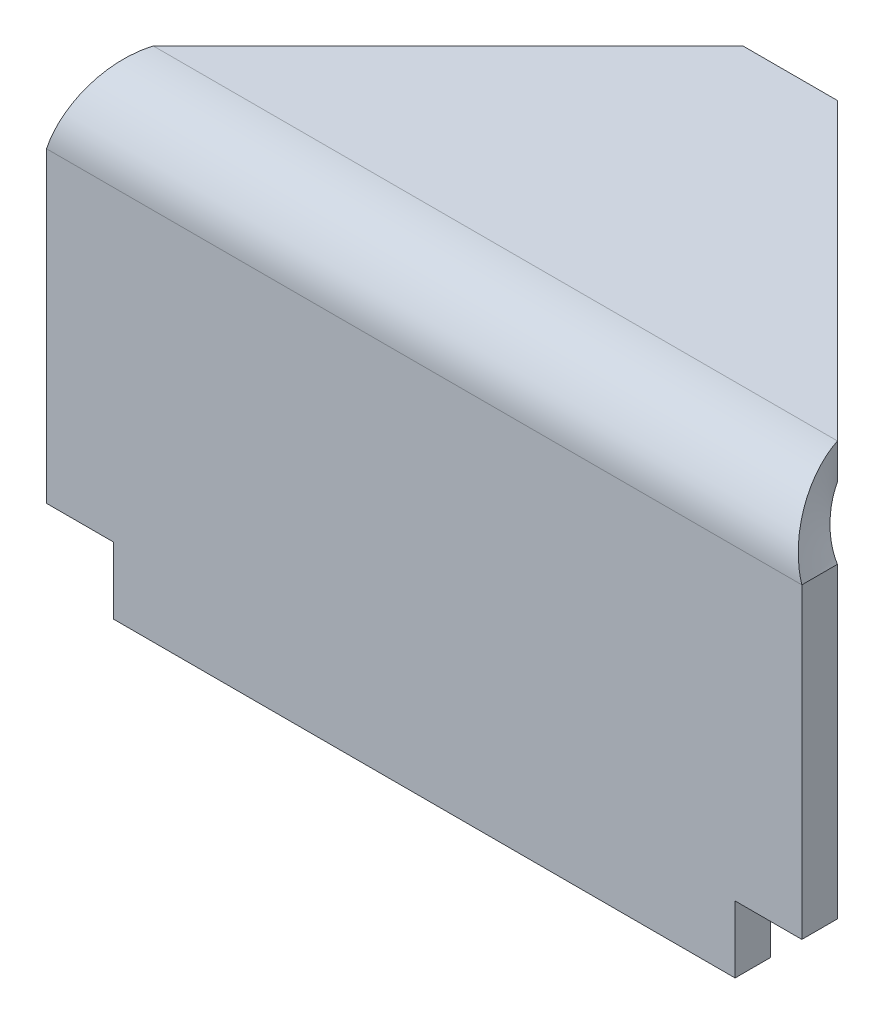
ISO-10303-21;
HEADER;
FILE_DESCRIPTION(('STEP AP214'),'2;1');
FILE_NAME('part.step','',(''),(''),'','','');
FILE_SCHEMA(('AUTOMOTIVE_DESIGN { 1 0 10303 214 1 1 1 1 }'));
ENDSEC;
DATA;
#1=APPLICATION_CONTEXT('core data for automotive mechanical design processes');
#2=APPLICATION_PROTOCOL_DEFINITION('international standard','automotive_design',2000,#1);
#3=PRODUCT_CONTEXT('',#1,'mechanical');
#4=PRODUCT('Part','Part','',(#3));
#5=PRODUCT_RELATED_PRODUCT_CATEGORY('part','',(#4));
#6=PRODUCT_DEFINITION_FORMATION('','',#4);
#7=PRODUCT_DEFINITION_CONTEXT('part definition',#1,'design');
#8=PRODUCT_DEFINITION('design','',#6,#7);
#9=PRODUCT_DEFINITION_SHAPE('','',#8);
#10=(LENGTH_UNIT() NAMED_UNIT(*) SI_UNIT(.MILLI.,.METRE.));
#11=(NAMED_UNIT(*) PLANE_ANGLE_UNIT() SI_UNIT($,.RADIAN.));
#12=(NAMED_UNIT(*) SI_UNIT($,.STERADIAN.) SOLID_ANGLE_UNIT());
#13=UNCERTAINTY_MEASURE_WITH_UNIT(LENGTH_MEASURE(1.E-05),#10,'distance_accuracy_value','');
#14=(GEOMETRIC_REPRESENTATION_CONTEXT(3) GLOBAL_UNCERTAINTY_ASSIGNED_CONTEXT((#13)) GLOBAL_UNIT_ASSIGNED_CONTEXT((#10,
#11,#12)) REPRESENTATION_CONTEXT('',''));
#15=CARTESIAN_POINT('',(0.,0.,0.));
#16=DIRECTION('',(0.,0.,1.));
#17=DIRECTION('',(1.,0.,0.));
#18=AXIS2_PLACEMENT_3D('',#15,#16,#17);
#19=CARTESIAN_POINT('',(0.,-8.,-84.8528137423857));
#20=DIRECTION('',(-0.707106781186548,0.,-0.707106781186547));
#21=DIRECTION('',(-0.707106781186547,0.,0.707106781186548));
#22=AXIS2_PLACEMENT_3D('',#19,#20,#21);
#23=PLANE('',#22);
#24=DIRECTION('',(-0.707106781186547,0.,0.707106781186548));
#25=VECTOR('',#24,1.);
#26=CARTESIAN_POINT('',(0.,0.,-84.8528137423857));
#27=LINE('',#26,#25);
#28=CARTESIAN_POINT('',(-10.6066017177983,0.,-74.2462120245875));
#29=VERTEX_POINT('',#28);
#30=CARTESIAN_POINT('',(-76.8528137423857,0.,-7.99999999999999));
#31=VERTEX_POINT('',#30);
#32=EDGE_CURVE('E178',#29,#31,#27,.T.);
#33=ORIENTED_EDGE('',*,*,#32,.F.);
#34=DIRECTION('',(0.,-1.,0.));
#35=VECTOR('',#34,1.);
#36=CARTESIAN_POINT('',(-10.6066017177983,-8.,-74.2462120245875));
#37=LINE('',#36,#35);
#38=CARTESIAN_POINT('',(-10.6066017177983,-8.,-74.2462120245875));
#39=VERTEX_POINT('',#38);
#40=EDGE_CURVE('E46',#29,#39,#37,.T.);
#41=ORIENTED_EDGE('',*,*,#40,.T.);
#42=DIRECTION('',(-0.707106781186547,0.,0.707106781186548));
#43=VECTOR('',#42,1.);
#44=CARTESIAN_POINT('',(0.,-8.,-84.8528137423857));
#45=LINE('',#44,#43);
#46=CARTESIAN_POINT('',(-76.8528137423857,-8.,-8.));
#47=VERTEX_POINT('',#46);
#48=EDGE_CURVE('E227',#39,#47,#45,.T.);
#49=ORIENTED_EDGE('',*,*,#48,.T.);
#50=DIRECTION('',(0.,1.,0.));
#51=VECTOR('',#50,1.);
#52=CARTESIAN_POINT('',(-76.8528137423857,-7.99999999999997,-8.));
#53=LINE('',#52,#51);
#54=EDGE_CURVE('E179',#47,#31,#53,.T.);
#55=ORIENTED_EDGE('',*,*,#54,.T.);
#56=EDGE_LOOP('',(#33,#41,#49,#55));
#57=FACE_BOUND('',#56,.T.);
#58=ADVANCED_FACE('F38',(#57),#23,.T.);
#59=CARTESIAN_POINT('',(84.8528137423857,-8.,0.));
#60=DIRECTION('',(0.707106781186547,0.,-0.707106781186548));
#61=DIRECTION('',(-0.707106781186548,0.,-0.707106781186547));
#62=AXIS2_PLACEMENT_3D('',#59,#60,#61);
#63=PLANE('',#62);
#64=DIRECTION('',(-0.707106781186548,0.,-0.707106781186547));
#65=VECTOR('',#64,1.);
#66=CARTESIAN_POINT('',(84.8528137423857,-8.,0.));
#67=LINE('',#66,#65);
#68=CARTESIAN_POINT('',(76.8528137423857,-8.,-8.00000000000003));
#69=VERTEX_POINT('',#68);
#70=CARTESIAN_POINT('',(10.6066017177982,-8.,-74.2462120245875));
#71=VERTEX_POINT('',#70);
#72=EDGE_CURVE('E266',#69,#71,#67,.T.);
#73=ORIENTED_EDGE('',*,*,#72,.T.);
#74=DIRECTION('',(0.,1.,0.));
#75=VECTOR('',#74,1.);
#76=CARTESIAN_POINT('',(10.6066017177982,-8.,-74.2462120245875));
#77=LINE('',#76,#75);
#78=CARTESIAN_POINT('',(10.6066017177982,0.,-74.2462120245875));
#79=VERTEX_POINT('',#78);
#80=EDGE_CURVE('E262',#71,#79,#77,.T.);
#81=ORIENTED_EDGE('',*,*,#80,.T.);
#82=DIRECTION('',(-0.707106781186548,0.,-0.707106781186547));
#83=VECTOR('',#82,1.);
#84=CARTESIAN_POINT('',(84.8528137423857,0.,0.));
#85=LINE('',#84,#83);
#86=CARTESIAN_POINT('',(76.8528137423857,0.,-8.00000000000003));
#87=VERTEX_POINT('',#86);
#88=EDGE_CURVE('E256',#87,#79,#85,.T.);
#89=ORIENTED_EDGE('',*,*,#88,.F.);
#90=DIRECTION('',(0.,1.,0.));
#91=VECTOR('',#90,1.);
#92=CARTESIAN_POINT('',(76.8528137423857,-7.99999999999997,-8.00000000000002));
#93=LINE('',#92,#91);
#94=EDGE_CURVE('E175',#69,#87,#93,.T.);
#95=ORIENTED_EDGE('',*,*,#94,.F.);
#96=EDGE_LOOP('',(#73,#81,#89,#95));
#97=FACE_BOUND('',#96,.T.);
#98=ADVANCED_FACE('F245',(#97),#63,.T.);
#99=CARTESIAN_POINT('',(0.,-8.,0.));
#100=DIRECTION('',(0.,-1.,0.));
#101=DIRECTION('',(0.,0.,-1.));
#102=AXIS2_PLACEMENT_3D('',#99,#100,#101);
#103=PLANE('',#102);
#104=ORIENTED_EDGE('',*,*,#48,.F.);
#105=DIRECTION('',(-1.,0.,0.));
#106=VECTOR('',#105,1.);
#107=CARTESIAN_POINT('',(0.,-8.,-74.2462120245875));
#108=LINE('',#107,#106);
#109=EDGE_CURVE('E11',#39,#71,#108,.F.);
#110=ORIENTED_EDGE('',*,*,#109,.T.);
#111=ORIENTED_EDGE('',*,*,#72,.F.);
#112=DIRECTION('',(-1.,0.,0.));
#113=VECTOR('',#112,1.);
#114=CARTESIAN_POINT('',(-84.8528137423857,-7.99999999999997,-8.));
#115=LINE('',#114,#113);
#116=EDGE_CURVE('E167',#47,#69,#115,.F.);
#117=ORIENTED_EDGE('',*,*,#116,.F.);
#118=EDGE_LOOP('',(#104,#110,#111,#117));
#119=FACE_BOUND('',#118,.T.);
#120=ADVANCED_FACE('F235',(#119),#103,.T.);
#121=CARTESIAN_POINT('',(0.,0.,0.));
#122=DIRECTION('',(0.,-1.,0.));
#123=DIRECTION('',(0.,0.,-1.));
#124=AXIS2_PLACEMENT_3D('',#121,#122,#123);
#125=PLANE('',#124);
#126=ORIENTED_EDGE('',*,*,#88,.T.);
#127=DIRECTION('',(1.,0.,0.));
#128=VECTOR('',#127,1.);
#129=CARTESIAN_POINT('',(10.6066017177982,0.,-74.2462120245875));
#130=LINE('',#129,#128);
#131=EDGE_CURVE('E60',#79,#29,#130,.F.);
#132=ORIENTED_EDGE('',*,*,#131,.T.);
#133=ORIENTED_EDGE('',*,*,#32,.T.);
#134=DIRECTION('',(-1.,0.,0.));
#135=VECTOR('',#134,1.);
#136=CARTESIAN_POINT('',(-84.8528137423857,0.,-7.99999999999999));
#137=LINE('',#136,#135);
#138=EDGE_CURVE('E171',#31,#87,#137,.F.);
#139=ORIENTED_EDGE('',*,*,#138,.T.);
#140=EDGE_LOOP('',(#126,#132,#133,#139));
#141=FACE_BOUND('',#140,.T.);
#142=ADVANCED_FACE('F244',(#141),#125,.F.);
#143=CARTESIAN_POINT('',(76.8528137423857,0.080000000000026,-8.00000000000004));
#144=CARTESIAN_POINT('',(77.5195897851141,0.0800000000000273,-5.89478796351405));
#145=CARTESIAN_POINT('',(78.186147075719,-0.338519359173458,-3.79109401950281));
#146=CARTESIAN_POINT('',(79.5194804090524,-1.94951487526351,0.0981932043640329));
#147=CARTESIAN_POINT('',(80.186147075719,-3.14135717423723,1.8819112571966));
#148=CARTESIAN_POINT('',(81.5194804090524,-6.11808874280334,4.85864282576271));
#149=CARTESIAN_POINT('',(82.1861470757191,-7.90180679563591,6.05048512473644));
#150=CARTESIAN_POINT('',(83.5194804090524,-11.7910940195027,7.66148064082649));
#151=CARTESIAN_POINT('',(84.1860376996573,-13.894787963514,8.07999999999997));
#152=CARTESIAN_POINT('',(84.8528137423857,-16.,8.07999999999997));
#153=CARTESIAN_POINT('',(76.8528137423857,0.,-8.00000000000004));
#154=CARTESIAN_POINT('',(77.5195895490439,0.,-5.90526202421113));
#155=CARTESIAN_POINT('',(78.186147075719,-0.416437173306923,-3.81203385025155));
#156=CARTESIAN_POINT('',(79.5194804090524,-2.01941778633185,0.057903685934361));
#157=CARTESIAN_POINT('',(80.186147075719,-3.20533052162909,1.83274751959861));
#158=CARTESIAN_POINT('',(81.5194804090524,-6.16725248040133,4.79466947837086));
#159=CARTESIAN_POINT('',(82.1861470757191,-7.94209631406558,5.9805822136681));
#160=CARTESIAN_POINT('',(83.5194804090524,-11.8120338502515,7.58356282669302));
#161=CARTESIAN_POINT('',(84.1860379357275,-13.9052620242111,7.99999999999997));
#162=CARTESIAN_POINT('',(84.8528137423857,-16.,7.99999999999997));
#163=CARTESIAN_POINT('',(76.8528137423857,-7.99999999999997,-8.00000000000003));
#164=CARTESIAN_POINT('',(77.5195659420278,-7.99999999999997,-6.95266809391979));
#165=CARTESIAN_POINT('',(78.186147075719,-8.20821858665345,-5.90601692512579));
#166=CARTESIAN_POINT('',(79.5194804090524,-9.00970889316591,-3.97104815703283));
#167=CARTESIAN_POINT('',(80.186147075719,-9.60266526081453,-3.08362624020071));
#168=CARTESIAN_POINT('',(81.5194804090524,-11.0836262402007,-1.60266526081459));
#169=CARTESIAN_POINT('',(82.1861470757191,-11.9710481570328,-1.00970889316596));
#170=CARTESIAN_POINT('',(83.5194804090524,-13.9060169251257,-0.208218586653501));
#171=CARTESIAN_POINT('',(84.1860615427436,-14.9526680939197,0.));
#172=CARTESIAN_POINT('',(84.8528137423857,-16.,0.));
#173=CARTESIAN_POINT('',(76.8528137423857,-8.08079999999998,-8.00000000000003));
#174=CARTESIAN_POINT('',(77.519565703597,-8.08079999999998,-6.96324689522385));
#175=CARTESIAN_POINT('',(78.186147075719,-8.28691557892825,-5.92716615418202));
#176=CARTESIAN_POINT('',(79.5194804090524,-9.08031083334493,-4.0117405706468));
#177=CARTESIAN_POINT('',(80.186147075719,-9.6672783416803,-3.13328161517468));
#178=CARTESIAN_POINT('',(81.5194804090524,-11.1332816151746,-1.66727834168036));
#179=CARTESIAN_POINT('',(82.1861470757191,-12.0117405706467,-1.08031083334499));
#180=CARTESIAN_POINT('',(83.5194804090524,-13.927166154182,-0.286915578928301));
#181=CARTESIAN_POINT('',(84.1860617811744,-14.9632468952238,-0.0808000000000276));
#182=CARTESIAN_POINT('',(84.8528137423857,-16.,-0.0808000000000278));
#183=B_SPLINE_SURFACE_WITH_KNOTS('',1,3,((#143,#144,#145,#146,#147,#148,#149,#150,#151,#152),
(#153,#154,#155,#156,#157,#158,#159,#160,#161,#162),(#163,#164,#165,#166,#167,#168,#169,#170,
#171,#172),(#173,#174,#175,#176,#177,#178,#179,#180,#181,#182)),.UNSPECIFIED.,.F.,.F.,.F.,(2,1,
1,2),(4,2,2,2,4),(-0.01,0.,1.,1.0101),(0.,0.25,0.5,0.75,1.),.UNSPECIFIED.);
#184=DIRECTION('',(0.,0.,1.));
#185=VECTOR('',#184,1.);
#186=CARTESIAN_POINT('',(84.8528137423857,-16.,0.));
#187=LINE('',#186,#185);
#188=CARTESIAN_POINT('',(84.8528137423857,-15.9999999999999,0.));
#189=VERTEX_POINT('',#188);
#190=CARTESIAN_POINT('',(84.8528137423857,-15.9999999999999,7.99999999999997));
#191=VERTEX_POINT('',#190);
#192=EDGE_CURVE('E283',#189,#191,#187,.T.);
#193=CARTESIAN_POINT('',(76.8528137423857,-7.99999999999997,-8.00000000000003));
#194=CARTESIAN_POINT('',(76.9749189400977,-7.99998738498239,-7.80820315116032));
#195=CARTESIAN_POINT('',(77.0970243577444,-8.00689689739085,-7.61640815139459));
#196=CARTESIAN_POINT('',(77.3412292631348,-8.03446882717196,-7.2338127074068));
#197=CARTESIAN_POINT('',(77.4633287509491,-8.05513086442409,-7.04301223584283));
#198=CARTESIAN_POINT('',(77.707522144721,-8.11011649611955,-6.6633860446777));
#199=CARTESIAN_POINT('',(77.8296160506801,-8.14444008695765,-6.47456032455543));
#200=CARTESIAN_POINT('',(78.0736248447141,-8.22650560001264,-6.10014240831911));
#201=CARTESIAN_POINT('',(78.1955397307061,-8.27422761798111,-5.9145458461419));
#202=CARTESIAN_POINT('',(78.4393717022721,-8.38286335616471,-5.54726700202294));
#203=CARTESIAN_POINT('',(78.5612887873735,-8.4437763652548,-5.36558450965436));
#204=CARTESIAN_POINT('',(78.8051041750122,-8.57847035141285,-5.0070798345975));
#205=CARTESIAN_POINT('',(78.9270024782729,-8.65225032430575,-4.83025727387179));
#206=CARTESIAN_POINT('',(79.218936261308,-8.84391362495795,-4.41367646753827));
#207=CARTESIAN_POINT('',(79.3889844909762,-8.96771147885369,-4.17661908006798));
#208=CARTESIAN_POINT('',(79.7290727908021,-9.23840213503381,-3.71605717089866));
#209=CARTESIAN_POINT('',(79.8991128579397,-9.38529750901114,-3.49255416219737));
#210=CARTESIAN_POINT('',(80.2391001143304,-9.70060065685136,-3.06149570812018));
#211=CARTESIAN_POINT('',(80.4090472942256,-9.86899475159644,-2.85393025539158));
#212=CARTESIAN_POINT('',(80.7489421939448,-10.2256813820518,-2.45667015261631));
#213=CARTESIAN_POINT('',(80.9188899137652,-10.4139738533153,-2.26697544469372));
#214=CARTESIAN_POINT('',(81.2587720685316,-10.8085596734352,-1.90736531709746));
#215=CARTESIAN_POINT('',(81.4287065035438,-11.0148517105418,-1.73744845818148));
#216=CARTESIAN_POINT('',(81.7685686452424,-11.443396982379,-1.41907140620825));
#217=CARTESIAN_POINT('',(81.9384963515758,-11.6656506939236,-1.27061185453226));
#218=CARTESIAN_POINT('',(82.2784167006783,-12.1239454252777,-0.996607359126772));
#219=CARTESIAN_POINT('',(82.4484093468098,-12.3599908394198,-0.87106977196313));
#220=CARTESIAN_POINT('',(82.788383257162,-12.8434319366419,-0.64423009159432));
#221=CARTESIAN_POINT('',(82.9583645204965,-13.090826333482,-0.542925260011286));
#222=CARTESIAN_POINT('',(83.2721040786101,-13.5556516805042,-0.379227125741147));
#223=CARTESIAN_POINT('',(83.4158663688316,-13.7718243718864,-0.313243090472209));
#224=CARTESIAN_POINT('',(83.7033707934883,-14.2089645876502,-0.199796503644891));
#225=CARTESIAN_POINT('',(83.8471129283668,-14.4299315679775,-0.152331861996371));
#226=CARTESIAN_POINT('',(84.13450160139,-14.8749283514481,-0.0762947037190452));
#227=CARTESIAN_POINT('',(84.2781481365561,-15.0989559196096,-0.0477090822954684));
#228=CARTESIAN_POINT('',(84.5654669162563,-15.5486543535626,-0.00954830364290483));
#229=CARTESIAN_POINT('',(84.7091391614521,-15.7743254573621,2.4042942755739E-05));
#230=CARTESIAN_POINT('',(84.8528137423857,-16.,0.));
#231=B_SPLINE_CURVE_WITH_KNOTS('',3,(#193,#194,#195,#196,#197,#198,#199,#200,#201,#202,#203,
#204,#205,#206,#207,#208,#209,#210,#211,#212,#213,#214,#215,#216,#217,#218,#219,#220,#221,#222,
#223,#224,#225,#226,#227,#228,#229,#230),.UNSPECIFIED.,.F.,.F.,(4,2,2,2,2,2,2,2,2,2,2,2,2,2,2,2,
2,2,4),(0.,0.681993655959275,1.3639684623603,2.04594308879171,2.72690990929965,3.4078400280874,
4.08871702888055,5.03828930648889,5.987967385056,6.93704419006551,7.8861179213033,
8.83512254481493,9.78415552919938,10.7334925625186,11.6827222670239,12.4856593054104,
13.2885056984665,14.0907942115984,14.893201314458),.UNSPECIFIED.);
#232=EDGE_CURVE('E170',#69,#189,#231,.T.);
#233=CARTESIAN_POINT('',(76.8528137423857,0.,-8.00000000000004));
#234=CARTESIAN_POINT('',(76.9530502869086,1.15024033777008E-05,-7.68510328388166));
#235=CARTESIAN_POINT('',(77.0532884418186,-0.00929581702943927,-7.37020843234942));
#236=CARTESIAN_POINT('',(77.253758318419,-0.0464640994099785,-6.74153165556721));
#237=CARTESIAN_POINT('',(77.353990040171,-0.0743240884168942,-6.42774967276535));
#238=CARTESIAN_POINT('',(77.5544460857959,-0.14851304700506,-5.80238026617461));
#239=CARTESIAN_POINT('',(77.6546704097707,-0.194841678483456,-5.49079280231723));
#240=CARTESIAN_POINT('',(77.8550387064282,-0.305758847520925,-4.87113723363835));
#241=CARTESIAN_POINT('',(77.9551826806912,-0.370333085899775,-4.56306656861021));
#242=CARTESIAN_POINT('',(78.1554739657707,-0.517533839070055,-3.95126876337701));
#243=CARTESIAN_POINT('',(78.2556212765351,-0.600160144560493,-3.64754157285592));
#244=CARTESIAN_POINT('',(78.4559155007144,-0.783167395292755,-3.04550578582104));
#245=CARTESIAN_POINT('',(78.5560624141281,-0.883548233026464,-2.74719715650857));
#246=CARTESIAN_POINT('',(78.8065267934713,-1.15638193681905,-2.00918311532842));
#247=CARTESIAN_POINT('',(78.9568559967877,-1.33975473289744,-1.57347203555686));
#248=CARTESIAN_POINT('',(79.2575409632407,-1.74435829976984,-0.719906174484315));
#249=CARTESIAN_POINT('',(79.4078967272657,-1.96559405909139,-0.302053755178077));
#250=CARTESIAN_POINT('',(79.6333730530951,-2.32442906699824,0.308703801469487));
#251=CARTESIAN_POINT('',(79.7085244039113,-2.44854153071094,0.509624941849588));
#252=CARTESIAN_POINT('',(79.8588050156483,-2.70549708624667,0.905723387232024));
#253=CARTESIAN_POINT('',(79.9339342768243,-2.83833770703975,1.10090229545673));
#254=CARTESIAN_POINT('',(80.1593396341803,-3.24965192878628,1.67736514405021));
#255=CARTESIAN_POINT('',(80.3096465057581,-3.54093898829818,2.04961110792482));
#256=CARTESIAN_POINT('',(80.6102374211007,-4.1552301698679,2.76682005604089));
#257=CARTESIAN_POINT('',(80.7605214657102,-4.47823226672857,3.11178477981827));
#258=CARTESIAN_POINT('',(81.061092667058,-5.15346702769173,3.77181466486682));
#259=CARTESIAN_POINT('',(81.2113798238115,-5.50569992354069,4.08687958904512));
#260=CARTESIAN_POINT('',(81.512018407182,-6.2368339452153,4.68477893279997));
#261=CARTESIAN_POINT('',(81.6623698364956,-6.61574516710953,4.9676010432961));
#262=CARTESIAN_POINT('',(81.8878450769687,-7.20162335610023,5.3657914188243));
#263=CARTESIAN_POINT('',(81.9629974287016,-7.39984177740627,5.49418505458265));
#264=CARTESIAN_POINT('',(82.1133234865278,-7.80181714070781,5.74210942353164));
#265=CARTESIAN_POINT('',(82.1884971931448,-8.00557549318082,5.86163787019713));
#266=CARTESIAN_POINT('',(82.4140588017073,-8.6245884287063,6.20656240983627));
#267=CARTESIAN_POINT('',(82.5644767883094,-9.04755374582897,6.41827925936554));
#268=CARTESIAN_POINT('',(82.8653089453811,-9.9105626444077,6.80344676613464));
#269=CARTESIAN_POINT('',(83.0157231158583,-10.3506061880811,6.97689750802609));
#270=CARTESIAN_POINT('',(83.2412474970562,-11.0205914766168,7.20727635962572));
#271=CARTESIAN_POINT('',(83.3163821198497,-11.2454996865588,7.2790848845239));
#272=CARTESIAN_POINT('',(83.4666284453339,-11.6982137510493,7.41266765098847));
#273=CARTESIAN_POINT('',(83.5417401490624,-11.9260188678944,7.47444439409875));
#274=CARTESIAN_POINT('',(83.7670276694371,-12.6130664836463,7.64452468991259));
#275=CARTESIAN_POINT('',(83.9172304152528,-13.0761635100623,7.73765469555086));
#276=CARTESIAN_POINT('',(84.198438187062,-13.9491456593358,7.87335710649834));
#277=CARTESIAN_POINT('',(84.3294466700287,-14.358278525338,7.92086519082938));
#278=CARTESIAN_POINT('',(84.5912363359011,-15.178261124095,7.98417144820137));
#279=CARTESIAN_POINT('',(84.7220175115308,-15.5891065474743,8.00002548677578));
#280=CARTESIAN_POINT('',(84.8528137423857,-16.,7.99999999999997));
#281=B_SPLINE_CURVE_WITH_KNOTS('',3,(#233,#234,#235,#236,#237,#238,#239,#240,#241,#242,#243,
#244,#245,#246,#247,#248,#249,#250,#251,#252,#253,#254,#255,#256,#257,#258,#259,#260,#261,#262,
#263,#264,#265,#266,#267,#268,#269,#270,#271,#272,#273,#274,#275,#276,#277,#278,#279,#280),
.UNSPECIFIED.,.F.,.F.,(4,2,2,2,2,2,2,2,2,2,2,2,2,2,2,2,2,2,2,2,2,2,2,4),(0.,0.991262901778278,
1.98247377032825,2.97366649375273,3.96408455849809,4.95449114065355,5.94489172585588,
7.43122101817071,8.9177462885612,9.66105105409362,10.4041462817621,11.8902061083128,
13.3761711025834,14.8621478789491,16.3486900584142,17.0920123790776,17.8355257567968,
19.3226554558179,20.8097818650032,21.5528696930581,22.2957719378483,23.780839113095,
25.076364615482,26.3696016449655),.UNSPECIFIED.);
#282=EDGE_CURVE('E173',#87,#191,#281,.T.);
#283=ORIENTED_EDGE('',*,*,#192,.F.);
#284=ORIENTED_EDGE('',*,*,#232,.F.);
#285=ORIENTED_EDGE('',*,*,#94,.T.);
#286=ORIENTED_EDGE('',*,*,#282,.T.);
#287=EDGE_LOOP('',(#283,#284,#285,#286));
#288=FACE_BOUND('',#287,.T.);
#289=ADVANCED_FACE('F196',(#288),#183,.F.);
#290=CARTESIAN_POINT('',(-84.8528137423857,-16.,8.07999999999999));
#291=CARTESIAN_POINT('',(-84.1860376996573,-13.894787963514,8.07999999999999));
#292=CARTESIAN_POINT('',(-83.5194804090524,-11.7910940195028,7.66148064082651));
#293=CARTESIAN_POINT('',(-82.186147075719,-7.90180679563592,6.05048512473646));
#294=CARTESIAN_POINT('',(-81.5194804090524,-6.11808874280335,4.85864282576273));
#295=CARTESIAN_POINT('',(-80.186147075719,-3.14135717423724,1.88191125719663));
#296=CARTESIAN_POINT('',(-79.5194804090524,-1.94951487526351,0.0981932043640624));
#297=CARTESIAN_POINT('',(-78.1861470757191,-0.338519359173462,-3.79109401950277));
#298=CARTESIAN_POINT('',(-77.5195897851141,0.0800000000000242,-5.89478796351401));
#299=CARTESIAN_POINT('',(-76.8528137423857,0.080000000000026,-7.99999999999999));
#300=CARTESIAN_POINT('',(-84.8528137423857,-16.,7.99999999999999));
#301=CARTESIAN_POINT('',(-84.1860379357275,-13.9052620242111,7.99999999999999));
#302=CARTESIAN_POINT('',(-83.5194804090524,-11.8120338502515,7.58356282669304));
#303=CARTESIAN_POINT('',(-82.186147075719,-7.94209631406559,5.98058221366812));
#304=CARTESIAN_POINT('',(-81.5194804090524,-6.16725248040134,4.79466947837088));
#305=CARTESIAN_POINT('',(-80.186147075719,-3.20533052162909,1.83274751959864));
#306=CARTESIAN_POINT('',(-79.5194804090524,-2.01941778633185,0.0579036859343904));
#307=CARTESIAN_POINT('',(-78.1861470757191,-0.416437173306927,-3.81203385025151));
#308=CARTESIAN_POINT('',(-77.519589549044,0.,-5.9052620242111));
#309=CARTESIAN_POINT('',(-76.8528137423857,0.,-7.99999999999999));
#310=CARTESIAN_POINT('',(-84.8528137423857,-16.,0.));
#311=CARTESIAN_POINT('',(-84.1860615427436,-14.9526680939197,0.));
#312=CARTESIAN_POINT('',(-83.5194804090524,-13.9060169251257,-0.208218586653484));
#313=CARTESIAN_POINT('',(-82.186147075719,-11.9710481570328,-1.00970889316594));
#314=CARTESIAN_POINT('',(-81.5194804090524,-11.0836262402007,-1.60266526081457));
#315=CARTESIAN_POINT('',(-80.186147075719,-9.60266526081453,-3.08362624020069));
#316=CARTESIAN_POINT('',(-79.5194804090524,-9.00970889316591,-3.97104815703281));
#317=CARTESIAN_POINT('',(-78.1861470757191,-8.20821858665345,-5.90601692512576));
#318=CARTESIAN_POINT('',(-77.5195659420278,-7.99999999999997,-6.95266809391977));
#319=CARTESIAN_POINT('',(-76.8528137423857,-7.99999999999997,-8.));
#320=CARTESIAN_POINT('',(-84.8528137423857,-16.,-0.0808000000000087));
#321=CARTESIAN_POINT('',(-84.1860617811744,-14.9632468952238,-0.0808000000000087));
#322=CARTESIAN_POINT('',(-83.5194804090524,-13.927166154182,-0.286915578928283));
#323=CARTESIAN_POINT('',(-82.186147075719,-12.0117405706467,-1.08031083334497));
#324=CARTESIAN_POINT('',(-81.5194804090524,-11.1332816151746,-1.66727834168034));
#325=CARTESIAN_POINT('',(-80.186147075719,-9.66727834168031,-3.13328161517466));
#326=CARTESIAN_POINT('',(-79.5194804090524,-9.08031083334494,-4.01174057064678));
#327=CARTESIAN_POINT('',(-78.1861470757191,-8.28691557892825,-5.92716615418199));
#328=CARTESIAN_POINT('',(-77.519565703597,-8.08079999999998,-6.96324689522383));
#329=CARTESIAN_POINT('',(-76.8528137423857,-8.08079999999998,-8.));
#330=B_SPLINE_SURFACE_WITH_KNOTS('',1,3,((#290,#291,#292,#293,#294,#295,#296,#297,#298,#299),
(#300,#301,#302,#303,#304,#305,#306,#307,#308,#309),(#310,#311,#312,#313,#314,#315,#316,#317,
#318,#319),(#320,#321,#322,#323,#324,#325,#326,#327,#328,#329)),.UNSPECIFIED.,.F.,.F.,.F.,(2,1,
1,2),(4,2,2,2,4),(-0.01,0.,1.,1.0101),(0.,0.25,0.5,0.75,1.),.UNSPECIFIED.);
#331=CARTESIAN_POINT('',(-84.8528137423857,-16.,0.));
#332=CARTESIAN_POINT('',(-84.7307085446737,-15.8082031511603,1.2615017575794E-05));
#333=CARTESIAN_POINT('',(-84.608603127027,-15.6164081513945,-0.00689689739087983));
#334=CARTESIAN_POINT('',(-84.3643982216366,-15.2338127074067,-0.0344688271719898));
#335=CARTESIAN_POINT('',(-84.2422987338223,-15.0430122358428,-0.0551308644241245));
#336=CARTESIAN_POINT('',(-83.9981053400504,-14.6633860446776,-0.110116496119583));
#337=CARTESIAN_POINT('',(-83.8760114340914,-14.4745603245554,-0.144440086957691));
#338=CARTESIAN_POINT('',(-83.6320026400573,-14.100142408319,-0.226505600012678));
#339=CARTESIAN_POINT('',(-83.5100877540653,-13.9145458461418,-0.274227617981151));
#340=CARTESIAN_POINT('',(-83.2662557824993,-13.5472670020229,-0.382863356164753));
#341=CARTESIAN_POINT('',(-83.1443386973979,-13.3655845096543,-0.443776365254834));
#342=CARTESIAN_POINT('',(-82.9005233097592,-13.0070798345974,-0.578470351412889));
#343=CARTESIAN_POINT('',(-82.7786250064985,-12.8302572738717,-0.652250324305788));
#344=CARTESIAN_POINT('',(-82.4866912234634,-12.4136764675382,-0.843913624957984));
#345=CARTESIAN_POINT('',(-82.3166429937953,-12.1766190800679,-0.967711478853723));
#346=CARTESIAN_POINT('',(-81.9765546939693,-11.7160571708986,-1.23840213503385));
#347=CARTESIAN_POINT('',(-81.8065146268317,-11.4925541621973,-1.38529750901118));
#348=CARTESIAN_POINT('',(-81.466527370441,-11.0614957081201,-1.7006006568514));
#349=CARTESIAN_POINT('',(-81.2965801905458,-10.8539302553915,-1.86899475159647));
#350=CARTESIAN_POINT('',(-80.9566852908267,-10.4566701526163,-2.22568138205185));
#351=CARTESIAN_POINT('',(-80.7867375710063,-10.2669754446937,-2.41397385331539));
#352=CARTESIAN_POINT('',(-80.4468554162399,-9.90736531709739,-2.80855967343526));
#353=CARTESIAN_POINT('',(-80.2769209812276,-9.73744845818143,-3.01485171054184));
#354=CARTESIAN_POINT('',(-79.9370588395291,-9.4190714062082,-3.44339698237904));
#355=CARTESIAN_POINT('',(-79.7671311331956,-9.27061185453221,-3.66565069392362));
#356=CARTESIAN_POINT('',(-79.4272107840931,-8.99660735912671,-4.12394542527776));
#357=CARTESIAN_POINT('',(-79.2572181379616,-8.87106977196307,-4.35999083941989));
#358=CARTESIAN_POINT('',(-78.9172442276095,-8.64423009159426,-4.84343193664198));
#359=CARTESIAN_POINT('',(-78.7472629642749,-8.54292526001123,-5.09082633348209));
#360=CARTESIAN_POINT('',(-78.4335234061613,-8.37922712574109,-5.55565168050424));
#361=CARTESIAN_POINT('',(-78.2897611159398,-8.31324309047215,-5.77182437188642));
#362=CARTESIAN_POINT('',(-78.0022566912831,-8.19979650364484,-6.2089645876502));
#363=CARTESIAN_POINT('',(-77.8585145564046,-8.15233186199631,-6.42993156797751));
#364=CARTESIAN_POINT('',(-77.5711258833814,-8.07629470371899,-6.87492835144809));
#365=CARTESIAN_POINT('',(-77.4274793482153,-8.04770908229541,-7.09895591960963));
#366=CARTESIAN_POINT('',(-77.1401605685151,-8.00954830364285,-7.54865435356259));
#367=CARTESIAN_POINT('',(-76.9964883233194,-7.99997595705719,-7.77432545736213));
#368=CARTESIAN_POINT('',(-76.8528137423857,-7.99999999999997,-8.));
#369=B_SPLINE_CURVE_WITH_KNOTS('',3,(#331,#332,#333,#334,#335,#336,#337,#338,#339,#340,#341,
#342,#343,#344,#345,#346,#347,#348,#349,#350,#351,#352,#353,#354,#355,#356,#357,#358,#359,#360,
#361,#362,#363,#364,#365,#366,#367,#368),.UNSPECIFIED.,.F.,.F.,(4,2,2,2,2,2,2,2,2,2,2,2,2,2,2,2,
2,2,4),(0.,0.681993655959281,1.36396846236031,2.04594308879172,2.72690990929966,
3.40784002808739,4.08871702888055,5.03828930648889,5.98796738505599,6.9370441900655,
7.88611792130328,8.8351225448149,9.78415552919938,10.7334925625186,11.6827222670239,
12.4856593054104,13.2885056984664,14.0907942115984,14.893201314458),.UNSPECIFIED.);
#370=CARTESIAN_POINT('',(-84.8528137423857,-15.9999999999999,0.));
#371=VERTEX_POINT('',#370);
#372=EDGE_CURVE('E153',#371,#47,#369,.T.);
#373=DIRECTION('',(0.,0.,1.));
#374=VECTOR('',#373,1.);
#375=CARTESIAN_POINT('',(-84.8528137423857,-16.,0.));
#376=LINE('',#375,#374);
#377=CARTESIAN_POINT('',(-84.8528137423857,-16.,8.));
#378=VERTEX_POINT('',#377);
#379=EDGE_CURVE('E282',#371,#378,#376,.T.);
#380=CARTESIAN_POINT('',(-84.8528137423857,-16.,7.99999999999999));
#381=CARTESIAN_POINT('',(-84.7525771978628,-15.6851032838816,8.00001150240334));
#382=CARTESIAN_POINT('',(-84.6523390429529,-15.3702084323493,7.99070418297052));
#383=CARTESIAN_POINT('',(-84.4518691663524,-14.7415316555671,7.95353590058999));
#384=CARTESIAN_POINT('',(-84.3516374446004,-14.4277496727653,7.92567591158307));
#385=CARTESIAN_POINT('',(-84.1511813989755,-13.8023802661745,7.8514869529949));
#386=CARTESIAN_POINT('',(-84.0509570750007,-13.4907928023172,7.80515832151651));
#387=CARTESIAN_POINT('',(-83.8505887783431,-12.8711372336383,7.69424115247904));
#388=CARTESIAN_POINT('',(-83.7504448040802,-12.5630665686101,7.62966691410019));
#389=CARTESIAN_POINT('',(-83.5501535190007,-11.9512687633769,7.48246616092991));
#390=CARTESIAN_POINT('',(-83.4500062082363,-11.6475415728559,7.39983985543947));
#391=CARTESIAN_POINT('',(-83.249711984057,-11.045505785821,7.2168326047072));
#392=CARTESIAN_POINT('',(-83.1495650706433,-10.7471971565085,7.1164517669735));
#393=CARTESIAN_POINT('',(-82.8991006913001,-10.0091831153284,6.84361806318092));
#394=CARTESIAN_POINT('',(-82.7487714879837,-9.57347203555679,6.66024526710252));
#395=CARTESIAN_POINT('',(-82.4480865215308,-8.71990617448424,6.25564170023011));
#396=CARTESIAN_POINT('',(-82.2977307575057,-8.30205375517801,6.03440594090856));
#397=CARTESIAN_POINT('',(-82.0722544316763,-7.69129619853044,5.67557093300171));
#398=CARTESIAN_POINT('',(-81.9971030808602,-7.49037505815033,5.55145846928901));
#399=CARTESIAN_POINT('',(-81.8468224691231,-7.09427661276789,5.29450291375328));
#400=CARTESIAN_POINT('',(-81.7716932079471,-6.8990977045432,5.1616622929602));
#401=CARTESIAN_POINT('',(-81.5462878505911,-6.32263485594973,4.75034807121367));
#402=CARTESIAN_POINT('',(-81.3959809790133,-5.95038889207511,4.45906101170177));
#403=CARTESIAN_POINT('',(-81.0953900636708,-5.23317994395904,3.84476983013204));
#404=CARTESIAN_POINT('',(-80.9451060190613,-4.88821522018165,3.52176773327137));
#405=CARTESIAN_POINT('',(-80.6445348177135,-4.2281853351331,2.84653297230821));
#406=CARTESIAN_POINT('',(-80.49424766096,-3.91312041095481,2.49430007645925));
#407=CARTESIAN_POINT('',(-80.1936090775894,-3.31522106719997,1.76316605478464));
#408=CARTESIAN_POINT('',(-80.0432576482759,-3.03239895670383,1.38425483289042));
#409=CARTESIAN_POINT('',(-79.8177824078028,-2.63420858117563,0.79837664389972));
#410=CARTESIAN_POINT('',(-79.7426300560698,-2.50581494541729,0.600158222593673));
#411=CARTESIAN_POINT('',(-79.5923039982436,-2.2578905764683,0.198182859292137));
#412=CARTESIAN_POINT('',(-79.5171302916266,-2.13836212980281,-0.00557549318086782));
#413=CARTESIAN_POINT('',(-79.2915686830641,-1.79343759016368,-0.624588428706351));
#414=CARTESIAN_POINT('',(-79.141150696462,-1.5817207406344,-1.04755374582902));
#415=CARTESIAN_POINT('',(-78.8403185393904,-1.1965532338653,-1.91056264440775));
#416=CARTESIAN_POINT('',(-78.6899043689131,-1.02310249197386,-2.35060618808112));
#417=CARTESIAN_POINT('',(-78.4643799877152,-0.792723640374228,-3.02059147661688));
#418=CARTESIAN_POINT('',(-78.3892453649217,-0.720915115476036,-3.24549968655881));
#419=CARTESIAN_POINT('',(-78.2389990394375,-0.587332349011468,-3.6982137510494));
#420=CARTESIAN_POINT('',(-78.163887335709,-0.525555605901183,-3.92601886789448));
#421=CARTESIAN_POINT('',(-77.9385998153343,-0.35547531008735,-4.61306648364635));
#422=CARTESIAN_POINT('',(-77.7883970695186,-0.262345304449088,-5.07616351006231));
#423=CARTESIAN_POINT('',(-77.5071892977094,-0.126642893501608,-5.94914565933583));
#424=CARTESIAN_POINT('',(-77.3761808147427,-0.0791348091705718,-6.35827852533803));
#425=CARTESIAN_POINT('',(-77.1143911488703,-0.0158285517985765,-7.17826112409498));
#426=CARTESIAN_POINT('',(-76.9836099732406,2.54867758384354E-05,-7.58910654747434));
#427=CARTESIAN_POINT('',(-76.8528137423857,0.,-7.99999999999999));
#428=B_SPLINE_CURVE_WITH_KNOTS('',3,(#380,#381,#382,#383,#384,#385,#386,#387,#388,#389,#390,
#391,#392,#393,#394,#395,#396,#397,#398,#399,#400,#401,#402,#403,#404,#405,#406,#407,#408,#409,
#410,#411,#412,#413,#414,#415,#416,#417,#418,#419,#420,#421,#422,#423,#424,#425,#426,#427),
.UNSPECIFIED.,.F.,.F.,(4,2,2,2,2,2,2,2,2,2,2,2,2,2,2,2,2,2,2,2,2,2,2,4),(0.,0.991262901778282,
1.98247377032825,2.97366649375273,3.9640845584981,4.95449114065356,5.94489172585589,
7.43122101817072,8.91774628856121,9.66105105409364,10.4041462817621,11.8902061083128,
13.3761711025834,14.8621478789491,16.3486900584142,17.0920123790776,17.8355257567968,
19.3226554558179,20.8097818650032,21.5528696930581,22.2957719378483,23.780839113095,
25.076364615482,26.3696016449655),.UNSPECIFIED.);
#429=EDGE_CURVE('E174',#378,#31,#428,.T.);
#430=ORIENTED_EDGE('',*,*,#372,.F.);
#431=ORIENTED_EDGE('',*,*,#379,.T.);
#432=ORIENTED_EDGE('',*,*,#429,.T.);
#433=ORIENTED_EDGE('',*,*,#54,.F.);
#434=EDGE_LOOP('',(#430,#431,#432,#433));
#435=FACE_BOUND('',#434,.T.);
#436=ADVANCED_FACE('F206',(#435),#330,.F.);
#437=CARTESIAN_POINT('',(-84.8528137423857,-16.,-8.00000000000001));
#438=DIRECTION('',(-1.,0.,0.));
#439=DIRECTION('',(0.,0.,1.));
#440=AXIS2_PLACEMENT_3D('',#437,#438,#439);
#441=CYLINDRICAL_SURFACE('',#440,16.);
#442=ORIENTED_EDGE('',*,*,#138,.F.);
#443=ORIENTED_EDGE('',*,*,#429,.F.);
#444=DIRECTION('',(-1.,0.,0.));
#445=VECTOR('',#444,1.);
#446=CARTESIAN_POINT('',(0.,-16.,7.99999999999999));
#447=LINE('',#446,#445);
#448=EDGE_CURVE('E164',#191,#378,#447,.T.);
#449=ORIENTED_EDGE('',*,*,#448,.F.);
#450=ORIENTED_EDGE('',*,*,#282,.F.);
#451=EDGE_LOOP('',(#442,#443,#449,#450));
#452=FACE_BOUND('',#451,.T.);
#453=ADVANCED_FACE('F201',(#452),#441,.T.);
#454=CARTESIAN_POINT('',(-84.8528137423857,-16.,-8.00000000000001));
#455=DIRECTION('',(-1.,0.,0.));
#456=DIRECTION('',(0.,0.,1.));
#457=AXIS2_PLACEMENT_3D('',#454,#455,#456);
#458=CYLINDRICAL_SURFACE('',#457,8.);
#459=ORIENTED_EDGE('',*,*,#116,.T.);
#460=ORIENTED_EDGE('',*,*,#232,.T.);
#461=DIRECTION('',(-1.,0.,0.));
#462=VECTOR('',#461,1.);
#463=CARTESIAN_POINT('',(84.8528137423857,-16.,0.));
#464=LINE('',#463,#462);
#465=EDGE_CURVE('E279',#189,#371,#464,.T.);
#466=ORIENTED_EDGE('',*,*,#465,.T.);
#467=ORIENTED_EDGE('',*,*,#372,.T.);
#468=EDGE_LOOP('',(#459,#460,#466,#467));
#469=FACE_BOUND('',#468,.T.);
#470=ADVANCED_FACE('F205',(#469),#458,.F.);
#471=CARTESIAN_POINT('',(-84.8528137423857,-7.99999999999997,7.99999999999998));
#472=DIRECTION('',(-1.,0.,0.));
#473=DIRECTION('',(0.,0.,1.));
#474=AXIS2_PLACEMENT_3D('',#471,#472,#473);
#475=PLANE('',#474);
#476=DIRECTION('',(0.,0.,1.));
#477=VECTOR('',#476,1.);
#478=CARTESIAN_POINT('',(-84.8528137423857,-85.,-84.8538137423858));
#479=LINE('',#478,#477);
#480=CARTESIAN_POINT('',(-84.8528137423857,-85.,2.4980018054066E-13));
#481=VERTEX_POINT('',#480);
#482=CARTESIAN_POINT('',(-84.8528137423857,-85.,7.99999999999993));
#483=VERTEX_POINT('',#482);
#484=EDGE_CURVE('E287',#481,#483,#479,.T.);
#485=ORIENTED_EDGE('',*,*,#484,.T.);
#486=DIRECTION('',(0.,1.,0.));
#487=VECTOR('',#486,1.);
#488=CARTESIAN_POINT('',(-84.8528137423857,-7.99999999999997,7.99999999999998));
#489=LINE('',#488,#487);
#490=EDGE_CURVE('E150',#483,#378,#489,.T.);
#491=ORIENTED_EDGE('',*,*,#490,.T.);
#492=ORIENTED_EDGE('',*,*,#379,.F.);
#493=DIRECTION('',(0.,1.,0.));
#494=VECTOR('',#493,1.);
#495=CARTESIAN_POINT('',(-84.8528137423857,-8.,0.));
#496=LINE('',#495,#494);
#497=EDGE_CURVE('E156',#481,#371,#496,.T.);
#498=ORIENTED_EDGE('',*,*,#497,.F.);
#499=EDGE_LOOP('',(#485,#491,#492,#498));
#500=FACE_BOUND('',#499,.T.);
#501=ADVANCED_FACE('F213',(#500),#475,.T.);
#502=CARTESIAN_POINT('',(84.8528137423857,-100.,8.00000000000027));
#503=DIRECTION('',(1.,0.,0.));
#504=DIRECTION('',(0.,0.,-1.));
#505=AXIS2_PLACEMENT_3D('',#502,#503,#504);
#506=PLANE('',#505);
#507=DIRECTION('',(0.,0.,1.));
#508=VECTOR('',#507,1.);
#509=CARTESIAN_POINT('',(84.8528137423857,-85.,-84.8538137423858));
#510=LINE('',#509,#508);
#511=CARTESIAN_POINT('',(84.8528137423857,-85.,2.13164735487076E-13));
#512=VERTEX_POINT('',#511);
#513=CARTESIAN_POINT('',(84.8528137423857,-85.,7.99999999999993));
#514=VERTEX_POINT('',#513);
#515=EDGE_CURVE('E299',#512,#514,#510,.T.);
#516=ORIENTED_EDGE('',*,*,#515,.F.);
#517=DIRECTION('',(0.,-1.,0.));
#518=VECTOR('',#517,1.);
#519=CARTESIAN_POINT('',(84.8528137423857,-100.,2.65536955569723E-13));
#520=LINE('',#519,#518);
#521=EDGE_CURVE('E160',#189,#512,#520,.T.);
#522=ORIENTED_EDGE('',*,*,#521,.F.);
#523=ORIENTED_EDGE('',*,*,#192,.T.);
#524=DIRECTION('',(0.,-1.,0.));
#525=VECTOR('',#524,1.);
#526=CARTESIAN_POINT('',(84.8528137423857,-100.,8.00000000000027));
#527=LINE('',#526,#525);
#528=EDGE_CURVE('E151',#191,#514,#527,.T.);
#529=ORIENTED_EDGE('',*,*,#528,.T.);
#530=EDGE_LOOP('',(#516,#522,#523,#529));
#531=FACE_BOUND('',#530,.T.);
#532=ADVANCED_FACE('F208',(#531),#506,.T.);
#533=CARTESIAN_POINT('',(0.,0.,7.99999999999993));
#534=DIRECTION('',(0.,0.,1.));
#535=DIRECTION('',(0.,-1.,0.));
#536=AXIS2_PLACEMENT_3D('',#533,#534,#535);
#537=PLANE('',#536);
#538=DIRECTION('',(-1.,0.,0.));
#539=VECTOR('',#538,1.);
#540=CARTESIAN_POINT('',(-84.8528137423857,-85.,7.99999999999993));
#541=LINE('',#540,#539);
#542=CARTESIAN_POINT('',(-69.8528137423857,-85.,7.99999999999993));
#543=VERTEX_POINT('',#542);
#544=EDGE_CURVE('E137',#543,#483,#541,.T.);
#545=ORIENTED_EDGE('',*,*,#544,.F.);
#546=DIRECTION('',(0.,1.,0.));
#547=VECTOR('',#546,1.);
#548=CARTESIAN_POINT('',(-69.8528137423857,-100.,7.99999999999993));
#549=LINE('',#548,#547);
#550=CARTESIAN_POINT('',(-69.8528137423857,-100.,7.99999999999993));
#551=VERTEX_POINT('',#550);
#552=EDGE_CURVE('E128',#551,#543,#549,.T.);
#553=ORIENTED_EDGE('',*,*,#552,.F.);
#554=DIRECTION('',(-1.,0.,0.));
#555=VECTOR('',#554,1.);
#556=CARTESIAN_POINT('',(-84.8528137423857,-100.,8.0000000000003));
#557=LINE('',#556,#555);
#558=CARTESIAN_POINT('',(69.8528137423856,-100.,8.00000000000027));
#559=VERTEX_POINT('',#558);
#560=EDGE_CURVE('E143',#559,#551,#557,.T.);
#561=ORIENTED_EDGE('',*,*,#560,.F.);
#562=DIRECTION('',(0.,-1.,0.));
#563=VECTOR('',#562,1.);
#564=CARTESIAN_POINT('',(69.8528137423857,-100.,7.99999999999993));
#565=LINE('',#564,#563);
#566=CARTESIAN_POINT('',(69.8528137423857,-85.,7.99999999999993));
#567=VERTEX_POINT('',#566);
#568=EDGE_CURVE('E311',#567,#559,#565,.T.);
#569=ORIENTED_EDGE('',*,*,#568,.F.);
#570=DIRECTION('',(-1.,0.,0.));
#571=VECTOR('',#570,1.);
#572=CARTESIAN_POINT('',(84.8528137423857,-85.,7.99999999999993));
#573=LINE('',#572,#571);
#574=EDGE_CURVE('E314',#514,#567,#573,.T.);
#575=ORIENTED_EDGE('',*,*,#574,.F.);
#576=ORIENTED_EDGE('',*,*,#528,.F.);
#577=ORIENTED_EDGE('',*,*,#448,.T.);
#578=ORIENTED_EDGE('',*,*,#490,.F.);
#579=EDGE_LOOP('',(#545,#553,#561,#569,#575,#576,#577,#578));
#580=FACE_BOUND('',#579,.T.);
#581=ADVANCED_FACE('F141',(#580),#537,.T.);
#582=CARTESIAN_POINT('',(0.,0.,0.));
#583=DIRECTION('',(0.,0.,1.));
#584=DIRECTION('',(0.,-1.,0.));
#585=AXIS2_PLACEMENT_3D('',#582,#583,#584);
#586=PLANE('',#585);
#587=DIRECTION('',(0.,-1.,0.));
#588=VECTOR('',#587,1.);
#589=CARTESIAN_POINT('',(-69.8528137423857,-99.9999999999997,2.91433543964104E-13));
#590=LINE('',#589,#588);
#591=CARTESIAN_POINT('',(-69.8528137423857,-85.,2.63677968348475E-13));
#592=VERTEX_POINT('',#591);
#593=CARTESIAN_POINT('',(-69.8528137423857,-100.,2.93955918296119E-13));
#594=VERTEX_POINT('',#593);
#595=EDGE_CURVE('E131',#592,#594,#590,.T.);
#596=ORIENTED_EDGE('',*,*,#595,.F.);
#597=DIRECTION('',(1.,0.,0.));
#598=VECTOR('',#597,1.);
#599=CARTESIAN_POINT('',(-84.8528137423857,-85.,2.4980018054066E-13));
#600=LINE('',#599,#598);
#601=EDGE_CURVE('E145',#481,#592,#600,.T.);
#602=ORIENTED_EDGE('',*,*,#601,.F.);
#603=ORIENTED_EDGE('',*,*,#497,.T.);
#604=ORIENTED_EDGE('',*,*,#465,.F.);
#605=ORIENTED_EDGE('',*,*,#521,.T.);
#606=DIRECTION('',(1.,0.,0.));
#607=VECTOR('',#606,1.);
#608=CARTESIAN_POINT('',(84.8528137423857,-85.,2.08166817117217E-13));
#609=LINE('',#608,#607);
#610=CARTESIAN_POINT('',(69.8528137423857,-85.,2.08166817117217E-13));
#611=VERTEX_POINT('',#610);
#612=EDGE_CURVE('E290',#611,#512,#609,.T.);
#613=ORIENTED_EDGE('',*,*,#612,.F.);
#614=DIRECTION('',(0.,1.,0.));
#615=VECTOR('',#614,1.);
#616=CARTESIAN_POINT('',(69.8528137423857,-99.9999999999997,2.63677968348475E-13));
#617=LINE('',#616,#615);
#618=CARTESIAN_POINT('',(69.8528137423857,-100.,2.63677968348475E-13));
#619=VERTEX_POINT('',#618);
#620=EDGE_CURVE('E304',#619,#611,#617,.T.);
#621=ORIENTED_EDGE('',*,*,#620,.F.);
#622=DIRECTION('',(-1.,0.,0.));
#623=VECTOR('',#622,1.);
#624=CARTESIAN_POINT('',(-84.8528137423857,-100.,2.96711373594201E-13));
#625=LINE('',#624,#623);
#626=EDGE_CURVE('E163',#619,#594,#625,.T.);
#627=ORIENTED_EDGE('',*,*,#626,.T.);
#628=EDGE_LOOP('',(#596,#602,#603,#604,#605,#613,#621,#627));
#629=FACE_BOUND('',#628,.T.);
#630=ADVANCED_FACE('F301',(#629),#586,.F.);
#631=CARTESIAN_POINT('',(-84.8528137423857,-100.,8.0000000000003));
#632=DIRECTION('',(0.,-1.,0.));
#633=DIRECTION('',(0.,0.,-1.));
#634=AXIS2_PLACEMENT_3D('',#631,#632,#633);
#635=PLANE('',#634);
#636=DIRECTION('',(0.,0.,1.));
#637=VECTOR('',#636,1.);
#638=CARTESIAN_POINT('',(-69.8528137423857,-100.,-84.8538137423858));
#639=LINE('',#638,#637);
#640=EDGE_CURVE('E125',#594,#551,#639,.T.);
#641=ORIENTED_EDGE('',*,*,#640,.F.);
#642=ORIENTED_EDGE('',*,*,#626,.F.);
#643=DIRECTION('',(0.,0.,1.));
#644=VECTOR('',#643,1.);
#645=CARTESIAN_POINT('',(69.8528137423857,-100.,-84.8538137423858));
#646=LINE('',#645,#644);
#647=EDGE_CURVE('E149',#619,#559,#646,.T.);
#648=ORIENTED_EDGE('',*,*,#647,.T.);
#649=ORIENTED_EDGE('',*,*,#560,.T.);
#650=EDGE_LOOP('',(#641,#642,#648,#649));
#651=FACE_BOUND('',#650,.T.);
#652=ADVANCED_FACE('F148',(#651),#635,.T.);
#653=CARTESIAN_POINT('',(69.8528137423857,-100.,-84.8538137423858));
#654=DIRECTION('',(-1.,0.,0.));
#655=DIRECTION('',(0.,0.,1.));
#656=AXIS2_PLACEMENT_3D('',#653,#654,#655);
#657=PLANE('',#656);
#658=ORIENTED_EDGE('',*,*,#620,.T.);
#659=DIRECTION('',(0.,0.,1.));
#660=VECTOR('',#659,1.);
#661=CARTESIAN_POINT('',(69.8528137423857,-85.,-84.8538137423858));
#662=LINE('',#661,#660);
#663=EDGE_CURVE('E307',#611,#567,#662,.T.);
#664=ORIENTED_EDGE('',*,*,#663,.T.);
#665=ORIENTED_EDGE('',*,*,#568,.T.);
#666=ORIENTED_EDGE('',*,*,#647,.F.);
#667=EDGE_LOOP('',(#658,#664,#665,#666));
#668=FACE_BOUND('',#667,.T.);
#669=ADVANCED_FACE('F336',(#668),#657,.F.);
#670=CARTESIAN_POINT('',(84.8528137423857,-85.,-84.8538137423858));
#671=DIRECTION('',(0.,1.,0.));
#672=DIRECTION('',(-1.,0.,0.));
#673=AXIS2_PLACEMENT_3D('',#670,#671,#672);
#674=PLANE('',#673);
#675=ORIENTED_EDGE('',*,*,#612,.T.);
#676=ORIENTED_EDGE('',*,*,#515,.T.);
#677=ORIENTED_EDGE('',*,*,#574,.T.);
#678=ORIENTED_EDGE('',*,*,#663,.F.);
#679=EDGE_LOOP('',(#675,#676,#677,#678));
#680=FACE_BOUND('',#679,.T.);
#681=ADVANCED_FACE('F341',(#680),#674,.F.);
#682=CARTESIAN_POINT('',(-84.8528137423857,-85.,-84.8538137423858));
#683=DIRECTION('',(0.,1.,0.));
#684=DIRECTION('',(0.,0.,1.));
#685=AXIS2_PLACEMENT_3D('',#682,#683,#684);
#686=PLANE('',#685);
#687=ORIENTED_EDGE('',*,*,#601,.T.);
#688=DIRECTION('',(0.,0.,1.));
#689=VECTOR('',#688,1.);
#690=CARTESIAN_POINT('',(-69.8528137423857,-85.,-84.8538137423858));
#691=LINE('',#690,#689);
#692=EDGE_CURVE('E136',#592,#543,#691,.T.);
#693=ORIENTED_EDGE('',*,*,#692,.T.);
#694=ORIENTED_EDGE('',*,*,#544,.T.);
#695=ORIENTED_EDGE('',*,*,#484,.F.);
#696=EDGE_LOOP('',(#687,#693,#694,#695));
#697=FACE_BOUND('',#696,.T.);
#698=ADVANCED_FACE('F325',(#697),#686,.F.);
#699=CARTESIAN_POINT('',(-69.8528137423857,-100.,-84.8538137423858));
#700=DIRECTION('',(1.,0.,0.));
#701=DIRECTION('',(0.,0.,-1.));
#702=AXIS2_PLACEMENT_3D('',#699,#700,#701);
#703=PLANE('',#702);
#704=ORIENTED_EDGE('',*,*,#595,.T.);
#705=ORIENTED_EDGE('',*,*,#640,.T.);
#706=ORIENTED_EDGE('',*,*,#552,.T.);
#707=ORIENTED_EDGE('',*,*,#692,.F.);
#708=EDGE_LOOP('',(#704,#705,#706,#707));
#709=FACE_BOUND('',#708,.T.);
#710=ADVANCED_FACE('F127',(#709),#703,.F.);
#711=CARTESIAN_POINT('',(10.6066017177982,-8.,-74.2462120245875));
#712=DIRECTION('',(0.,0.,1.));
#713=DIRECTION('',(0.,1.,0.));
#714=AXIS2_PLACEMENT_3D('',#711,#712,#713);
#715=PLANE('',#714);
#716=ORIENTED_EDGE('',*,*,#109,.F.);
#717=ORIENTED_EDGE('',*,*,#40,.F.);
#718=ORIENTED_EDGE('',*,*,#131,.F.);
#719=ORIENTED_EDGE('',*,*,#80,.F.);
#720=EDGE_LOOP('',(#716,#717,#718,#719));
#721=FACE_BOUND('',#720,.T.);
#722=ADVANCED_FACE('F40',(#721),#715,.F.);
#723=CLOSED_SHELL('',(#58,#98,#120,#142,#289,#436,#453,#470,#501,#532,#581,#630,#652,#669,#681,
#698,#710,#722));
#724=MANIFOLD_SOLID_BREP('B2',#723);
#725=ADVANCED_BREP_SHAPE_REPRESENTATION('',(#18,#724),#14);
#726=SHAPE_DEFINITION_REPRESENTATION(#9,#725);
ENDSEC;
END-ISO-10303-21;
